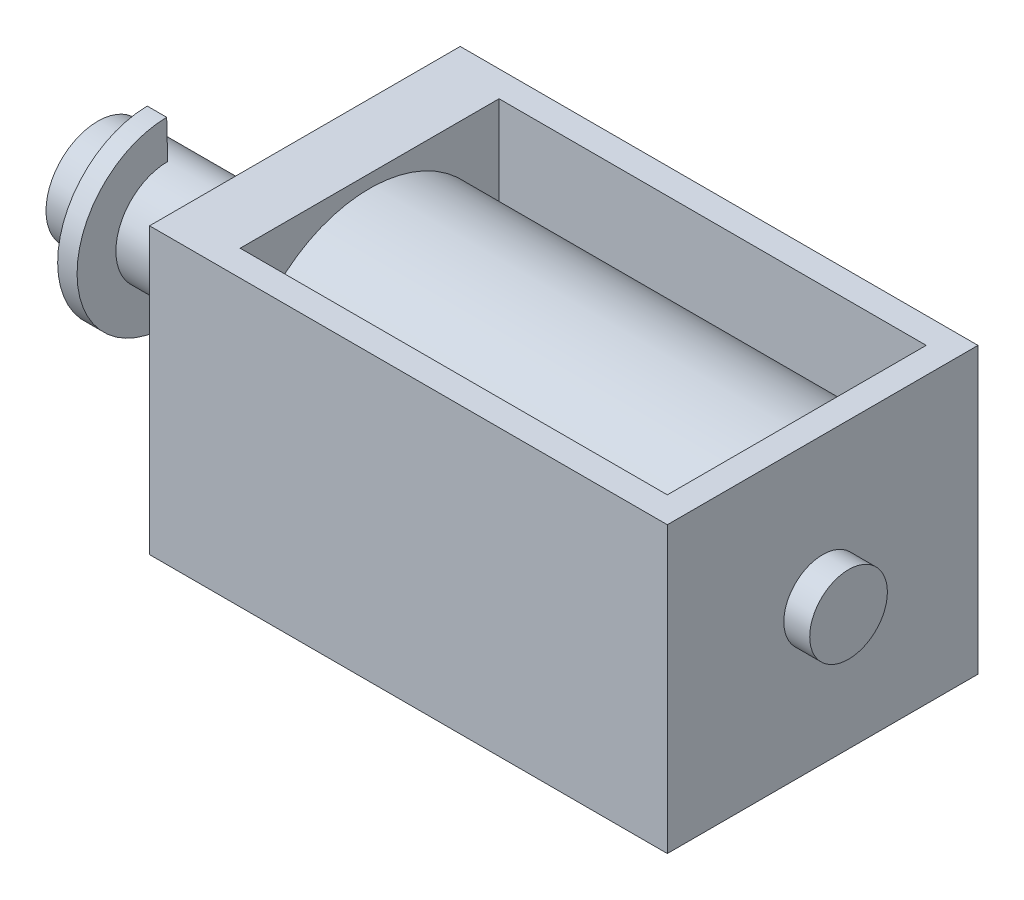
ISO-10303-21;
HEADER;
FILE_DESCRIPTION(('STEP AP214'),'2;1');
FILE_NAME('part.step','',(''),(''),'','','');
FILE_SCHEMA(('AUTOMOTIVE_DESIGN { 1 0 10303 214 1 1 1 1 }'));
ENDSEC;
DATA;
#1=APPLICATION_CONTEXT('core data for automotive mechanical design processes');
#2=APPLICATION_PROTOCOL_DEFINITION('international standard','automotive_design',2000,#1);
#3=PRODUCT_CONTEXT('',#1,'mechanical');
#4=PRODUCT('Part','Part','',(#3));
#5=PRODUCT_RELATED_PRODUCT_CATEGORY('part','',(#4));
#6=PRODUCT_DEFINITION_FORMATION('','',#4);
#7=PRODUCT_DEFINITION_CONTEXT('part definition',#1,'design');
#8=PRODUCT_DEFINITION('design','',#6,#7);
#9=PRODUCT_DEFINITION_SHAPE('','',#8);
#10=(LENGTH_UNIT() NAMED_UNIT(*) SI_UNIT(.MILLI.,.METRE.));
#11=(NAMED_UNIT(*) PLANE_ANGLE_UNIT() SI_UNIT($,.RADIAN.));
#12=(NAMED_UNIT(*) SI_UNIT($,.STERADIAN.) SOLID_ANGLE_UNIT());
#13=UNCERTAINTY_MEASURE_WITH_UNIT(LENGTH_MEASURE(1.E-05),#10,'distance_accuracy_value','');
#14=(GEOMETRIC_REPRESENTATION_CONTEXT(3) GLOBAL_UNCERTAINTY_ASSIGNED_CONTEXT((#13)) GLOBAL_UNIT_ASSIGNED_CONTEXT((#10,
#11,#12)) REPRESENTATION_CONTEXT('',''));
#15=CARTESIAN_POINT('',(0.,0.,0.));
#16=DIRECTION('',(0.,0.,1.));
#17=DIRECTION('',(1.,0.,0.));
#18=AXIS2_PLACEMENT_3D('',#15,#16,#17);
#19=CARTESIAN_POINT('',(19.,0.,-11.));
#20=DIRECTION('',(1.,0.,0.));
#21=DIRECTION('',(0.,0.,-1.));
#22=AXIS2_PLACEMENT_3D('',#19,#20,#21);
#23=PLANE('',#22);
#24=CARTESIAN_POINT('',(19.0000000000055,5.5,-6.));
#25=DIRECTION('',(1.,0.,0.));
#26=DIRECTION('',(0.,0.,-1.));
#27=AXIS2_PLACEMENT_3D('',#24,#25,#26);
#28=CIRCLE('',#27,5.);
#29=CARTESIAN_POINT('',(19.0000000000055,5.5,-11.));
#30=VERTEX_POINT('',#29);
#31=EDGE_CURVE('E11',#30,#30,#28,.T.);
#32=ORIENTED_EDGE('',*,*,#31,.T.);
#33=EDGE_LOOP('',(#32));
#34=FACE_BOUND('',#33,.T.);
#35=ADVANCED_FACE('F40',(#34),#23,.T.);
#36=CARTESIAN_POINT('',(2.5,5.5,-6.));
#37=DIRECTION('',(1.,0.,0.));
#38=DIRECTION('',(0.,0.,-1.));
#39=AXIS2_PLACEMENT_3D('',#36,#37,#38);
#40=PLANE('',#39);
#41=CARTESIAN_POINT('',(2.5,5.5,-6.));
#42=DIRECTION('',(1.,0.,0.));
#43=DIRECTION('',(0.,0.,-1.));
#44=AXIS2_PLACEMENT_3D('',#41,#42,#43);
#45=CIRCLE('',#44,5.);
#46=CARTESIAN_POINT('',(2.5,5.5,-11.));
#47=VERTEX_POINT('',#46);
#48=EDGE_CURVE('E46',#47,#47,#45,.T.);
#49=ORIENTED_EDGE('',*,*,#48,.F.);
#50=EDGE_LOOP('',(#49));
#51=FACE_BOUND('',#50,.T.);
#52=ADVANCED_FACE('F55',(#51),#40,.F.);
#53=CARTESIAN_POINT('',(500000.,5.5,-6.00000000006505));
#54=DIRECTION('',(-1.,0.,0.));
#55=DIRECTION('',(0.,0.,1.));
#56=AXIS2_PLACEMENT_3D('',#53,#54,#55);
#57=CYLINDRICAL_SURFACE('',#56,5.);
#58=ORIENTED_EDGE('',*,*,#48,.T.);
#59=EDGE_LOOP('',(#58));
#60=FACE_BOUND('',#59,.T.);
#61=ORIENTED_EDGE('',*,*,#31,.F.);
#62=EDGE_LOOP('',(#61));
#63=FACE_BOUND('',#62,.T.);
#64=ADVANCED_FACE('F52',(#60,#63),#57,.T.);
#65=CLOSED_SHELL('',(#35,#52,#64));
#66=MANIFOLD_SOLID_BREP('B2',#65);
#67=CARTESIAN_POINT('',(20.,11.,0.));
#68=DIRECTION('',(-1.,0.,0.));
#69=DIRECTION('',(0.,0.,1.));
#70=AXIS2_PLACEMENT_3D('',#67,#68,#69);
#71=PLANE('',#70);
#72=DIRECTION('',(0.,0.,-1.));
#73=VECTOR('',#72,1.);
#74=CARTESIAN_POINT('',(20.,0.,0.));
#75=LINE('',#74,#73);
#76=CARTESIAN_POINT('',(20.,0.,0.));
#77=VERTEX_POINT('',#76);
#78=CARTESIAN_POINT('',(20.,0.,-12.));
#79=VERTEX_POINT('',#78);
#80=EDGE_CURVE('E257',#77,#79,#75,.T.);
#81=ORIENTED_EDGE('',*,*,#80,.T.);
#82=DIRECTION('',(0.,-1.,0.));
#83=VECTOR('',#82,1.);
#84=CARTESIAN_POINT('',(20.,11.,-12.));
#85=LINE('',#84,#83);
#86=CARTESIAN_POINT('',(20.,11.,-12.));
#87=VERTEX_POINT('',#86);
#88=EDGE_CURVE('E262',#87,#79,#85,.T.);
#89=ORIENTED_EDGE('',*,*,#88,.F.);
#90=DIRECTION('',(0.,0.,-1.));
#91=VECTOR('',#90,1.);
#92=CARTESIAN_POINT('',(20.,11.,0.));
#93=LINE('',#92,#91);
#94=CARTESIAN_POINT('',(20.,11.,0.));
#95=VERTEX_POINT('',#94);
#96=EDGE_CURVE('E248',#95,#87,#93,.T.);
#97=ORIENTED_EDGE('',*,*,#96,.F.);
#98=DIRECTION('',(0.,-1.,0.));
#99=VECTOR('',#98,1.);
#100=CARTESIAN_POINT('',(20.,11.,0.));
#101=LINE('',#100,#99);
#102=EDGE_CURVE('E265',#95,#77,#101,.T.);
#103=ORIENTED_EDGE('',*,*,#102,.T.);
#104=EDGE_LOOP('',(#81,#89,#97,#103));
#105=FACE_BOUND('',#104,.T.);
#106=CARTESIAN_POINT('',(20.,5.5,-6.));
#107=DIRECTION('',(-1.,0.,0.));
#108=DIRECTION('',(0.,0.,1.));
#109=AXIS2_PLACEMENT_3D('',#106,#107,#108);
#110=CIRCLE('',#109,1.5);
#111=CARTESIAN_POINT('',(20.,5.5,-4.5));
#112=VERTEX_POINT('',#111);
#113=EDGE_CURVE('E38',#112,#112,#110,.F.);
#114=ORIENTED_EDGE('',*,*,#113,.F.);
#115=EDGE_LOOP('',(#114));
#116=FACE_BOUND('',#115,.T.);
#117=ADVANCED_FACE('F80',(#105,#116),#71,.F.);
#118=CARTESIAN_POINT('',(0.,11.,0.));
#119=DIRECTION('',(1.,0.,0.));
#120=DIRECTION('',(0.,0.,-1.));
#121=AXIS2_PLACEMENT_3D('',#118,#119,#120);
#122=PLANE('',#121);
#123=DIRECTION('',(0.,0.,1.));
#124=VECTOR('',#123,1.);
#125=CARTESIAN_POINT('',(0.,0.,0.));
#126=LINE('',#125,#124);
#127=CARTESIAN_POINT('',(0.,0.,-12.));
#128=VERTEX_POINT('',#127);
#129=CARTESIAN_POINT('',(0.,0.,0.));
#130=VERTEX_POINT('',#129);
#131=EDGE_CURVE('E235',#128,#130,#126,.T.);
#132=ORIENTED_EDGE('',*,*,#131,.T.);
#133=DIRECTION('',(0.,-1.,0.));
#134=VECTOR('',#133,1.);
#135=CARTESIAN_POINT('',(0.,11.,0.));
#136=LINE('',#135,#134);
#137=CARTESIAN_POINT('',(0.,11.,0.));
#138=VERTEX_POINT('',#137);
#139=EDGE_CURVE('E268',#138,#130,#136,.T.);
#140=ORIENTED_EDGE('',*,*,#139,.F.);
#141=DIRECTION('',(0.,0.,1.));
#142=VECTOR('',#141,1.);
#143=CARTESIAN_POINT('',(0.,11.,0.));
#144=LINE('',#143,#142);
#145=CARTESIAN_POINT('',(0.,11.,-12.));
#146=VERTEX_POINT('',#145);
#147=EDGE_CURVE('E242',#146,#138,#144,.T.);
#148=ORIENTED_EDGE('',*,*,#147,.F.);
#149=DIRECTION('',(0.,-1.,0.));
#150=VECTOR('',#149,1.);
#151=CARTESIAN_POINT('',(0.,11.,-12.));
#152=LINE('',#151,#150);
#153=EDGE_CURVE('E252',#146,#128,#152,.T.);
#154=ORIENTED_EDGE('',*,*,#153,.T.);
#155=EDGE_LOOP('',(#132,#140,#148,#154));
#156=FACE_BOUND('',#155,.T.);
#157=CARTESIAN_POINT('',(0.,5.5,-6.));
#158=DIRECTION('',(1.,0.,0.));
#159=DIRECTION('',(0.,0.,-1.));
#160=AXIS2_PLACEMENT_3D('',#157,#158,#159);
#161=CIRCLE('',#160,2.);
#162=CARTESIAN_POINT('',(0.,5.5,-8.));
#163=VERTEX_POINT('',#162);
#164=EDGE_CURVE('E88',#163,#163,#161,.F.);
#165=ORIENTED_EDGE('',*,*,#164,.F.);
#166=EDGE_LOOP('',(#165));
#167=FACE_BOUND('',#166,.T.);
#168=ADVANCED_FACE('F82',(#156,#167),#122,.F.);
#169=CARTESIAN_POINT('',(0.,11.,0.));
#170=DIRECTION('',(0.,0.,-1.));
#171=DIRECTION('',(-1.,0.,0.));
#172=AXIS2_PLACEMENT_3D('',#169,#170,#171);
#173=PLANE('',#172);
#174=DIRECTION('',(1.,0.,0.));
#175=VECTOR('',#174,1.);
#176=CARTESIAN_POINT('',(0.,0.,0.));
#177=LINE('',#176,#175);
#178=EDGE_CURVE('E255',#130,#77,#177,.T.);
#179=ORIENTED_EDGE('',*,*,#178,.T.);
#180=ORIENTED_EDGE('',*,*,#102,.F.);
#181=DIRECTION('',(1.,0.,0.));
#182=VECTOR('',#181,1.);
#183=CARTESIAN_POINT('',(0.,11.,0.));
#184=LINE('',#183,#182);
#185=EDGE_CURVE('E245',#138,#95,#184,.T.);
#186=ORIENTED_EDGE('',*,*,#185,.F.);
#187=ORIENTED_EDGE('',*,*,#139,.T.);
#188=EDGE_LOOP('',(#179,#180,#186,#187));
#189=FACE_BOUND('',#188,.T.);
#190=ADVANCED_FACE('F276',(#189),#173,.F.);
#191=CARTESIAN_POINT('',(0.,11.,-12.));
#192=DIRECTION('',(0.,0.,1.));
#193=DIRECTION('',(1.,0.,0.));
#194=AXIS2_PLACEMENT_3D('',#191,#192,#193);
#195=PLANE('',#194);
#196=DIRECTION('',(-1.,0.,0.));
#197=VECTOR('',#196,1.);
#198=CARTESIAN_POINT('',(0.,0.,-12.));
#199=LINE('',#198,#197);
#200=EDGE_CURVE('E246',#79,#128,#199,.T.);
#201=ORIENTED_EDGE('',*,*,#200,.T.);
#202=ORIENTED_EDGE('',*,*,#153,.F.);
#203=DIRECTION('',(-1.,0.,0.));
#204=VECTOR('',#203,1.);
#205=CARTESIAN_POINT('',(0.,11.,-12.));
#206=LINE('',#205,#204);
#207=EDGE_CURVE('E250',#87,#146,#206,.T.);
#208=ORIENTED_EDGE('',*,*,#207,.F.);
#209=ORIENTED_EDGE('',*,*,#88,.T.);
#210=EDGE_LOOP('',(#201,#202,#208,#209));
#211=FACE_BOUND('',#210,.T.);
#212=ADVANCED_FACE('F282',(#211),#195,.F.);
#213=CARTESIAN_POINT('',(0.,11.,0.));
#214=DIRECTION('',(0.,-1.,0.));
#215=DIRECTION('',(0.,0.,-1.));
#216=AXIS2_PLACEMENT_3D('',#213,#214,#215);
#217=PLANE('',#216);
#218=DIRECTION('',(1.,0.,0.));
#219=VECTOR('',#218,1.);
#220=CARTESIAN_POINT('',(2.5,11.,-1.));
#221=LINE('',#220,#219);
#222=CARTESIAN_POINT('',(2.5,11.,-1.));
#223=VERTEX_POINT('',#222);
#224=CARTESIAN_POINT('',(19.,11.,-1.));
#225=VERTEX_POINT('',#224);
#226=EDGE_CURVE('E225',#223,#225,#221,.T.);
#227=ORIENTED_EDGE('',*,*,#226,.F.);
#228=DIRECTION('',(0.,0.,1.));
#229=VECTOR('',#228,1.);
#230=CARTESIAN_POINT('',(2.5,11.,-11.));
#231=LINE('',#230,#229);
#232=CARTESIAN_POINT('',(2.5,11.,-11.));
#233=VERTEX_POINT('',#232);
#234=EDGE_CURVE('E209',#233,#223,#231,.T.);
#235=ORIENTED_EDGE('',*,*,#234,.F.);
#236=DIRECTION('',(-1.,0.,0.));
#237=VECTOR('',#236,1.);
#238=CARTESIAN_POINT('',(2.5,11.,-11.));
#239=LINE('',#238,#237);
#240=CARTESIAN_POINT('',(19.,11.,-11.));
#241=VERTEX_POINT('',#240);
#242=EDGE_CURVE('E214',#241,#233,#239,.T.);
#243=ORIENTED_EDGE('',*,*,#242,.F.);
#244=DIRECTION('',(0.,0.,-1.));
#245=VECTOR('',#244,1.);
#246=CARTESIAN_POINT('',(19.,11.,-11.));
#247=LINE('',#246,#245);
#248=EDGE_CURVE('E228',#225,#241,#247,.T.);
#249=ORIENTED_EDGE('',*,*,#248,.F.);
#250=EDGE_LOOP('',(#227,#235,#243,#249));
#251=FACE_BOUND('',#250,.T.);
#252=ORIENTED_EDGE('',*,*,#147,.T.);
#253=ORIENTED_EDGE('',*,*,#185,.T.);
#254=ORIENTED_EDGE('',*,*,#96,.T.);
#255=ORIENTED_EDGE('',*,*,#207,.T.);
#256=EDGE_LOOP('',(#252,#253,#254,#255));
#257=FACE_BOUND('',#256,.T.);
#258=ADVANCED_FACE('F297',(#251,#257),#217,.F.);
#259=CARTESIAN_POINT('',(0.,0.,0.));
#260=DIRECTION('',(0.,-1.,0.));
#261=DIRECTION('',(0.,0.,-1.));
#262=AXIS2_PLACEMENT_3D('',#259,#260,#261);
#263=PLANE('',#262);
#264=DIRECTION('',(0.,0.,1.));
#265=VECTOR('',#264,1.);
#266=CARTESIAN_POINT('',(2.5,0.,-11.));
#267=LINE('',#266,#265);
#268=CARTESIAN_POINT('',(2.5,0.,-11.));
#269=VERTEX_POINT('',#268);
#270=CARTESIAN_POINT('',(2.5,0.,-1.));
#271=VERTEX_POINT('',#270);
#272=EDGE_CURVE('E210',#269,#271,#267,.T.);
#273=ORIENTED_EDGE('',*,*,#272,.T.);
#274=DIRECTION('',(1.,0.,0.));
#275=VECTOR('',#274,1.);
#276=CARTESIAN_POINT('',(2.5,0.,-1.));
#277=LINE('',#276,#275);
#278=CARTESIAN_POINT('',(19.,0.,-1.));
#279=VERTEX_POINT('',#278);
#280=EDGE_CURVE('E213',#271,#279,#277,.T.);
#281=ORIENTED_EDGE('',*,*,#280,.T.);
#282=DIRECTION('',(0.,0.,-1.));
#283=VECTOR('',#282,1.);
#284=CARTESIAN_POINT('',(19.,0.,-11.));
#285=LINE('',#284,#283);
#286=CARTESIAN_POINT('',(19.,0.,-11.));
#287=VERTEX_POINT('',#286);
#288=EDGE_CURVE('E217',#279,#287,#285,.T.);
#289=ORIENTED_EDGE('',*,*,#288,.T.);
#290=DIRECTION('',(-1.,0.,0.));
#291=VECTOR('',#290,1.);
#292=CARTESIAN_POINT('',(2.5,0.,-11.));
#293=LINE('',#292,#291);
#294=EDGE_CURVE('E220',#287,#269,#293,.T.);
#295=ORIENTED_EDGE('',*,*,#294,.T.);
#296=EDGE_LOOP('',(#273,#281,#289,#295));
#297=FACE_BOUND('',#296,.T.);
#298=ORIENTED_EDGE('',*,*,#131,.F.);
#299=ORIENTED_EDGE('',*,*,#200,.F.);
#300=ORIENTED_EDGE('',*,*,#80,.F.);
#301=ORIENTED_EDGE('',*,*,#178,.F.);
#302=EDGE_LOOP('',(#298,#299,#300,#301));
#303=FACE_BOUND('',#302,.T.);
#304=ADVANCED_FACE('F292',(#297,#303),#263,.T.);
#305=CARTESIAN_POINT('',(2.5,0.,-11.));
#306=DIRECTION('',(-1.,0.,0.));
#307=DIRECTION('',(0.,0.,1.));
#308=AXIS2_PLACEMENT_3D('',#305,#306,#307);
#309=PLANE('',#308);
#310=ORIENTED_EDGE('',*,*,#234,.T.);
#311=DIRECTION('',(0.,1.,0.));
#312=VECTOR('',#311,1.);
#313=CARTESIAN_POINT('',(2.5,0.,-1.));
#314=LINE('',#313,#312);
#315=EDGE_CURVE('E223',#271,#223,#314,.T.);
#316=ORIENTED_EDGE('',*,*,#315,.F.);
#317=ORIENTED_EDGE('',*,*,#272,.F.);
#318=DIRECTION('',(0.,1.,0.));
#319=VECTOR('',#318,1.);
#320=CARTESIAN_POINT('',(2.5,0.,-11.));
#321=LINE('',#320,#319);
#322=EDGE_CURVE('E233',#269,#233,#321,.T.);
#323=ORIENTED_EDGE('',*,*,#322,.T.);
#324=EDGE_LOOP('',(#310,#316,#317,#323));
#325=FACE_BOUND('',#324,.T.);
#326=ADVANCED_FACE('F328',(#325),#309,.F.);
#327=CARTESIAN_POINT('',(2.5,0.,-11.));
#328=DIRECTION('',(0.,0.,-1.));
#329=DIRECTION('',(-1.,0.,0.));
#330=AXIS2_PLACEMENT_3D('',#327,#328,#329);
#331=PLANE('',#330);
#332=ORIENTED_EDGE('',*,*,#242,.T.);
#333=ORIENTED_EDGE('',*,*,#322,.F.);
#334=ORIENTED_EDGE('',*,*,#294,.F.);
#335=DIRECTION('',(0.,1.,0.));
#336=VECTOR('',#335,1.);
#337=CARTESIAN_POINT('',(19.,0.,-11.));
#338=LINE('',#337,#336);
#339=EDGE_CURVE('E236',#287,#241,#338,.T.);
#340=ORIENTED_EDGE('',*,*,#339,.T.);
#341=EDGE_LOOP('',(#332,#333,#334,#340));
#342=FACE_BOUND('',#341,.T.);
#343=ADVANCED_FACE('F324',(#342),#331,.F.);
#344=CARTESIAN_POINT('',(19.,0.,-11.));
#345=DIRECTION('',(1.,0.,0.));
#346=DIRECTION('',(0.,0.,-1.));
#347=AXIS2_PLACEMENT_3D('',#344,#345,#346);
#348=PLANE('',#347);
#349=ORIENTED_EDGE('',*,*,#248,.T.);
#350=ORIENTED_EDGE('',*,*,#339,.F.);
#351=ORIENTED_EDGE('',*,*,#288,.F.);
#352=DIRECTION('',(0.,1.,0.));
#353=VECTOR('',#352,1.);
#354=CARTESIAN_POINT('',(19.,0.,-1.));
#355=LINE('',#354,#353);
#356=EDGE_CURVE('E238',#279,#225,#355,.T.);
#357=ORIENTED_EDGE('',*,*,#356,.T.);
#358=EDGE_LOOP('',(#349,#350,#351,#357));
#359=FACE_BOUND('',#358,.T.);
#360=ADVANCED_FACE('F327',(#359),#348,.F.);
#361=CARTESIAN_POINT('',(2.5,0.,-1.));
#362=DIRECTION('',(0.,0.,1.));
#363=DIRECTION('',(1.,0.,0.));
#364=AXIS2_PLACEMENT_3D('',#361,#362,#363);
#365=PLANE('',#364);
#366=ORIENTED_EDGE('',*,*,#226,.T.);
#367=ORIENTED_EDGE('',*,*,#356,.F.);
#368=ORIENTED_EDGE('',*,*,#280,.F.);
#369=ORIENTED_EDGE('',*,*,#315,.T.);
#370=EDGE_LOOP('',(#366,#367,#368,#369));
#371=FACE_BOUND('',#370,.T.);
#372=ADVANCED_FACE('F323',(#371),#365,.F.);
#373=CARTESIAN_POINT('',(-8.,5.5,-6.));
#374=DIRECTION('',(1.,0.,0.));
#375=DIRECTION('',(0.,0.,-1.));
#376=AXIS2_PLACEMENT_3D('',#373,#374,#375);
#377=CYLINDRICAL_SURFACE('',#376,2.);
#378=DIRECTION('',(1.,0.,0.));
#379=VECTOR('',#378,1.);
#380=CARTESIAN_POINT('',(-6.05,3.5,-6.));
#381=LINE('',#380,#379);
#382=CARTESIAN_POINT('',(-6.05,3.5,-6.));
#383=VERTEX_POINT('',#382);
#384=CARTESIAN_POINT('',(-5.3,3.5,-6.));
#385=VERTEX_POINT('',#384);
#386=EDGE_CURVE('E95',#383,#385,#381,.T.);
#387=ORIENTED_EDGE('',*,*,#386,.F.);
#388=CARTESIAN_POINT('',(-6.05,5.5,-6.));
#389=DIRECTION('',(1.,0.,0.));
#390=DIRECTION('',(0.,0.,1.));
#391=AXIS2_PLACEMENT_3D('',#388,#389,#390);
#392=CIRCLE('',#391,2.);
#393=CARTESIAN_POINT('',(-6.05,7.5,-6.));
#394=VERTEX_POINT('',#393);
#395=EDGE_CURVE('E100',#394,#383,#392,.T.);
#396=ORIENTED_EDGE('',*,*,#395,.F.);
#397=DIRECTION('',(1.,0.,0.));
#398=VECTOR('',#397,1.);
#399=CARTESIAN_POINT('',(-6.05,7.5,-6.));
#400=LINE('',#399,#398);
#401=CARTESIAN_POINT('',(-5.3,7.5,-6.));
#402=VERTEX_POINT('',#401);
#403=EDGE_CURVE('E188',#394,#402,#400,.T.);
#404=ORIENTED_EDGE('',*,*,#403,.T.);
#405=CARTESIAN_POINT('',(-5.3,5.5,-6.));
#406=DIRECTION('',(1.,0.,0.));
#407=DIRECTION('',(0.,0.,1.));
#408=AXIS2_PLACEMENT_3D('',#405,#406,#407);
#409=CIRCLE('',#408,2.);
#410=EDGE_CURVE('E192',#402,#385,#409,.T.);
#411=ORIENTED_EDGE('',*,*,#410,.T.);
#412=EDGE_LOOP('',(#387,#396,#404,#411));
#413=FACE_BOUND('',#412,.T.);
#414=CARTESIAN_POINT('',(-8.,5.5,-6.));
#415=DIRECTION('',(-1.,0.,0.));
#416=DIRECTION('',(0.,0.,1.));
#417=AXIS2_PLACEMENT_3D('',#414,#415,#416);
#418=CIRCLE('',#417,2.);
#419=CARTESIAN_POINT('',(-8.,5.5,-4.));
#420=VERTEX_POINT('',#419);
#421=EDGE_CURVE('E206',#420,#420,#418,.T.);
#422=ORIENTED_EDGE('',*,*,#421,.F.);
#423=EDGE_LOOP('',(#422));
#424=FACE_BOUND('',#423,.T.);
#425=ORIENTED_EDGE('',*,*,#164,.T.);
#426=EDGE_LOOP('',(#425));
#427=FACE_BOUND('',#426,.T.);
#428=ADVANCED_FACE('F273',(#413,#424,#427),#377,.T.);
#429=CARTESIAN_POINT('',(-8.,5.5,-6.));
#430=DIRECTION('',(-1.,0.,0.));
#431=DIRECTION('',(0.,0.,1.));
#432=AXIS2_PLACEMENT_3D('',#429,#430,#431);
#433=PLANE('',#432);
#434=ORIENTED_EDGE('',*,*,#421,.T.);
#435=EDGE_LOOP('',(#434));
#436=FACE_BOUND('',#435,.T.);
#437=ADVANCED_FACE('F307',(#436),#433,.T.);
#438=CARTESIAN_POINT('',(21.,5.5,-6.));
#439=DIRECTION('',(-1.,0.,0.));
#440=DIRECTION('',(0.,0.,1.));
#441=AXIS2_PLACEMENT_3D('',#438,#439,#440);
#442=CYLINDRICAL_SURFACE('',#441,1.5);
#443=CARTESIAN_POINT('',(21.,5.5,-6.));
#444=DIRECTION('',(1.,0.,0.));
#445=DIRECTION('',(0.,0.,-1.));
#446=AXIS2_PLACEMENT_3D('',#443,#444,#445);
#447=CIRCLE('',#446,1.5);
#448=CARTESIAN_POINT('',(21.,5.5,-7.5));
#449=VERTEX_POINT('',#448);
#450=EDGE_CURVE('E203',#449,#449,#447,.T.);
#451=ORIENTED_EDGE('',*,*,#450,.F.);
#452=EDGE_LOOP('',(#451));
#453=FACE_BOUND('',#452,.T.);
#454=ORIENTED_EDGE('',*,*,#113,.T.);
#455=EDGE_LOOP('',(#454));
#456=FACE_BOUND('',#455,.T.);
#457=ADVANCED_FACE('F304',(#453,#456),#442,.T.);
#458=CARTESIAN_POINT('',(21.,5.5,-6.));
#459=DIRECTION('',(1.,0.,0.));
#460=DIRECTION('',(0.,0.,-1.));
#461=AXIS2_PLACEMENT_3D('',#458,#459,#460);
#462=PLANE('',#461);
#463=ORIENTED_EDGE('',*,*,#450,.T.);
#464=EDGE_LOOP('',(#463));
#465=FACE_BOUND('',#464,.T.);
#466=ADVANCED_FACE('F306',(#465),#462,.T.);
#467=CARTESIAN_POINT('',(-6.05,3.5,-6.));
#468=DIRECTION('',(0.,0.,1.));
#469=DIRECTION('',(1.,0.,0.));
#470=AXIS2_PLACEMENT_3D('',#467,#468,#469);
#471=PLANE('',#470);
#472=DIRECTION('',(0.,-1.,0.));
#473=VECTOR('',#472,1.);
#474=CARTESIAN_POINT('',(-5.3,3.5,-6.));
#475=LINE('',#474,#473);
#476=CARTESIAN_POINT('',(-5.3,2.,-6.));
#477=VERTEX_POINT('',#476);
#478=EDGE_CURVE('E178',#385,#477,#475,.T.);
#479=ORIENTED_EDGE('',*,*,#478,.T.);
#480=DIRECTION('',(1.,0.,0.));
#481=VECTOR('',#480,1.);
#482=CARTESIAN_POINT('',(-6.05,2.,-6.));
#483=LINE('',#482,#481);
#484=CARTESIAN_POINT('',(-6.05,2.,-6.));
#485=VERTEX_POINT('',#484);
#486=EDGE_CURVE('E175',#485,#477,#483,.T.);
#487=ORIENTED_EDGE('',*,*,#486,.F.);
#488=DIRECTION('',(0.,-1.,0.));
#489=VECTOR('',#488,1.);
#490=CARTESIAN_POINT('',(-6.05,3.5,-6.));
#491=LINE('',#490,#489);
#492=EDGE_CURVE('E166',#383,#485,#491,.T.);
#493=ORIENTED_EDGE('',*,*,#492,.F.);
#494=ORIENTED_EDGE('',*,*,#386,.T.);
#495=EDGE_LOOP('',(#479,#487,#493,#494));
#496=FACE_BOUND('',#495,.T.);
#497=ADVANCED_FACE('F176',(#496),#471,.F.);
#498=CARTESIAN_POINT('',(-6.05,5.5,-6.));
#499=DIRECTION('',(1.,0.,0.));
#500=DIRECTION('',(0.,0.,-1.));
#501=AXIS2_PLACEMENT_3D('',#498,#499,#500);
#502=CYLINDRICAL_SURFACE('',#501,3.5);
#503=CARTESIAN_POINT('',(-5.3,5.5,-6.));
#504=DIRECTION('',(-1.,0.,0.));
#505=DIRECTION('',(0.,0.,1.));
#506=AXIS2_PLACEMENT_3D('',#503,#504,#505);
#507=CIRCLE('',#506,3.5);
#508=CARTESIAN_POINT('',(-5.3,8.99978869200331,-5.96154078360436));
#509=VERTEX_POINT('',#508);
#510=EDGE_CURVE('E195',#477,#509,#507,.T.);
#511=ORIENTED_EDGE('',*,*,#510,.T.);
#512=DIRECTION('',(1.,0.,0.));
#513=VECTOR('',#512,1.);
#514=CARTESIAN_POINT('',(-6.05,8.99978869200331,-5.96154078360436));
#515=LINE('',#514,#513);
#516=CARTESIAN_POINT('',(-6.05,8.99978869200331,-5.96154078360436));
#517=VERTEX_POINT('',#516);
#518=EDGE_CURVE('E181',#517,#509,#515,.T.);
#519=ORIENTED_EDGE('',*,*,#518,.F.);
#520=CARTESIAN_POINT('',(-6.05,5.5,-6.));
#521=DIRECTION('',(-1.,0.,0.));
#522=DIRECTION('',(0.,0.,1.));
#523=AXIS2_PLACEMENT_3D('',#520,#521,#522);
#524=CIRCLE('',#523,3.5);
#525=EDGE_CURVE('E170',#485,#517,#524,.T.);
#526=ORIENTED_EDGE('',*,*,#525,.F.);
#527=ORIENTED_EDGE('',*,*,#486,.T.);
#528=EDGE_LOOP('',(#511,#519,#526,#527));
#529=FACE_BOUND('',#528,.T.);
#530=ADVANCED_FACE('F183',(#529),#502,.T.);
#531=CARTESIAN_POINT('',(-6.05,7.5,-6.));
#532=DIRECTION('',(0.,-0.0256346631075954,0.99967137802748));
#533=DIRECTION('',(0.,-0.99967137802748,-0.0256346631075954));
#534=AXIS2_PLACEMENT_3D('',#531,#532,#533);
#535=PLANE('',#534);
#536=DIRECTION('',(0.,-0.99967137802748,-0.0256346631075954));
#537=VECTOR('',#536,1.);
#538=CARTESIAN_POINT('',(-5.3,7.5,-6.));
#539=LINE('',#538,#537);
#540=EDGE_CURVE('E197',#509,#402,#539,.T.);
#541=ORIENTED_EDGE('',*,*,#540,.T.);
#542=ORIENTED_EDGE('',*,*,#403,.F.);
#543=DIRECTION('',(0.,-0.99967137802748,-0.0256346631075954));
#544=VECTOR('',#543,1.);
#545=CARTESIAN_POINT('',(-6.05,7.5,-6.));
#546=LINE('',#545,#544);
#547=EDGE_CURVE('E186',#517,#394,#546,.T.);
#548=ORIENTED_EDGE('',*,*,#547,.F.);
#549=ORIENTED_EDGE('',*,*,#518,.T.);
#550=EDGE_LOOP('',(#541,#542,#548,#549));
#551=FACE_BOUND('',#550,.T.);
#552=ADVANCED_FACE('F413',(#551),#535,.F.);
#553=CARTESIAN_POINT('',(-6.05,5.5,-6.));
#554=DIRECTION('',(-1.,0.,0.));
#555=DIRECTION('',(0.,0.,1.));
#556=AXIS2_PLACEMENT_3D('',#553,#554,#555);
#557=PLANE('',#556);
#558=ORIENTED_EDGE('',*,*,#395,.T.);
#559=ORIENTED_EDGE('',*,*,#492,.T.);
#560=ORIENTED_EDGE('',*,*,#525,.T.);
#561=ORIENTED_EDGE('',*,*,#547,.T.);
#562=EDGE_LOOP('',(#558,#559,#560,#561));
#563=FACE_BOUND('',#562,.T.);
#564=ADVANCED_FACE('F168',(#563),#557,.T.);
#565=CARTESIAN_POINT('',(-5.3,5.5,-6.));
#566=DIRECTION('',(-1.,0.,0.));
#567=DIRECTION('',(0.,0.,1.));
#568=AXIS2_PLACEMENT_3D('',#565,#566,#567);
#569=PLANE('',#568);
#570=ORIENTED_EDGE('',*,*,#410,.F.);
#571=ORIENTED_EDGE('',*,*,#540,.F.);
#572=ORIENTED_EDGE('',*,*,#510,.F.);
#573=ORIENTED_EDGE('',*,*,#478,.F.);
#574=EDGE_LOOP('',(#570,#571,#572,#573));
#575=FACE_BOUND('',#574,.T.);
#576=ADVANCED_FACE('F427',(#575),#569,.F.);
#577=CLOSED_SHELL('',(#117,#168,#190,#212,#258,#304,#326,#343,#360,#372,#428,#437,#457,#466,
#497,#530,#552,#564,#576));
#578=MANIFOLD_SOLID_BREP('B6',#577);
#579=ADVANCED_BREP_SHAPE_REPRESENTATION('',(#18,#66,#578),#14);
#580=SHAPE_DEFINITION_REPRESENTATION(#9,#579);
ENDSEC;
END-ISO-10303-21;
